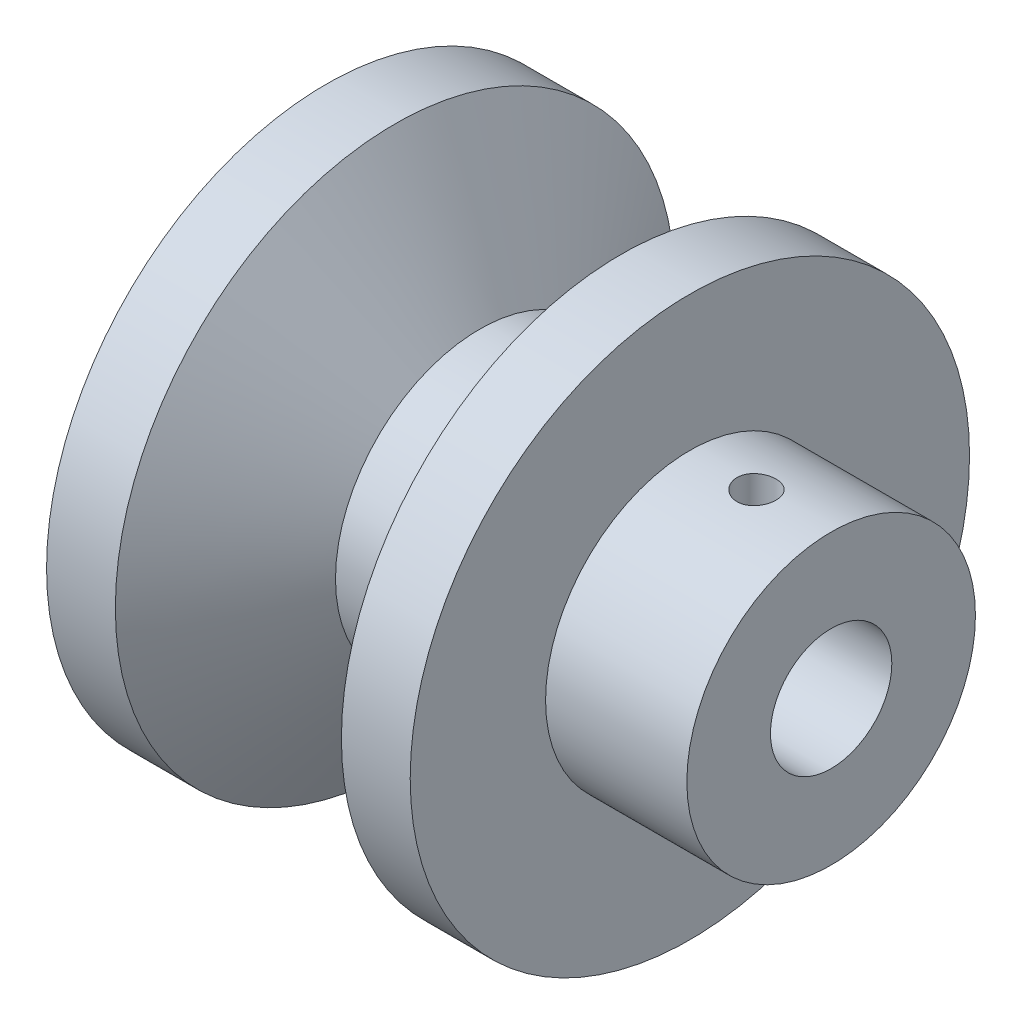
ISO-10303-21;
HEADER;
FILE_DESCRIPTION(('STEP AP214'),'2;1');
FILE_NAME('part.step','',(''),(''),'','','');
FILE_SCHEMA(('AUTOMOTIVE_DESIGN { 1 0 10303 214 1 1 1 1 }'));
ENDSEC;
DATA;
#1=APPLICATION_CONTEXT('core data for automotive mechanical design processes');
#2=APPLICATION_PROTOCOL_DEFINITION('international standard','automotive_design',2000,#1);
#3=PRODUCT_CONTEXT('',#1,'mechanical');
#4=PRODUCT('Part','Part','',(#3));
#5=PRODUCT_RELATED_PRODUCT_CATEGORY('part','',(#4));
#6=PRODUCT_DEFINITION_FORMATION('','',#4);
#7=PRODUCT_DEFINITION_CONTEXT('part definition',#1,'design');
#8=PRODUCT_DEFINITION('design','',#6,#7);
#9=PRODUCT_DEFINITION_SHAPE('','',#8);
#10=(LENGTH_UNIT() NAMED_UNIT(*) SI_UNIT(.MILLI.,.METRE.));
#11=(NAMED_UNIT(*) PLANE_ANGLE_UNIT() SI_UNIT($,.RADIAN.));
#12=(NAMED_UNIT(*) SI_UNIT($,.STERADIAN.) SOLID_ANGLE_UNIT());
#13=UNCERTAINTY_MEASURE_WITH_UNIT(LENGTH_MEASURE(1.E-05),#10,'distance_accuracy_value','');
#14=(GEOMETRIC_REPRESENTATION_CONTEXT(3) GLOBAL_UNCERTAINTY_ASSIGNED_CONTEXT((#13)) GLOBAL_UNIT_ASSIGNED_CONTEXT((#10,
#11,#12)) REPRESENTATION_CONTEXT('',''));
#15=CARTESIAN_POINT('',(0.,0.,0.));
#16=DIRECTION('',(0.,0.,1.));
#17=DIRECTION('',(1.,0.,0.));
#18=AXIS2_PLACEMENT_3D('',#15,#16,#17);
#19=CARTESIAN_POINT('',(30.4564854289592,2.,0.));
#20=DIRECTION('',(0.,1.,0.));
#21=DIRECTION('',(0.,0.,1.));
#22=AXIS2_PLACEMENT_3D('',#19,#20,#21);
#23=CYLINDRICAL_SURFACE('',#22,1.38499999999999);
#24=CARTESIAN_POINT('',(30.4564854289592,10.1195197210804,1.38499999999999));
#25=CARTESIAN_POINT('',(30.3790740439014,10.119520913612,1.38499674412126));
#26=CARTESIAN_POINT('',(30.3016156588465,10.1204175827245,1.37848798437401));
#27=CARTESIAN_POINT('',(30.1488585713256,10.1239055894623,1.3526284334532));
#28=CARTESIAN_POINT('',(30.0735621465307,10.1264986504853,1.33326458224626));
#29=CARTESIAN_POINT('',(29.9273625411416,10.13308046059,1.28227968027197));
#30=CARTESIAN_POINT('',(29.8564562641508,10.1370682124796,1.25066738530119));
#31=CARTESIAN_POINT('',(29.7209667831908,10.1459888918828,1.17610249364959));
#32=CARTESIAN_POINT('',(29.6563825854714,10.1509216704886,1.13315168317538));
#33=CARTESIAN_POINT('',(29.5349347212818,10.1612128380215,1.03682740673539));
#34=CARTESIAN_POINT('',(29.4781185664187,10.1665735538696,0.983394278669537));
#35=CARTESIAN_POINT('',(29.3742305416989,10.1770957203958,0.867750773530306));
#36=CARTESIAN_POINT('',(29.3271591766663,10.1822571607393,0.805539942012812));
#37=CARTESIAN_POINT('',(29.243924362765,10.1918232769019,0.673805817267354));
#38=CARTESIAN_POINT('',(29.2078042412051,10.1962249178516,0.604254908992159));
#39=CARTESIAN_POINT('',(29.1477749534494,10.2037498287602,0.460004401856181));
#40=CARTESIAN_POINT('',(29.1238652571513,10.2068731542147,0.385305026670298));
#41=CARTESIAN_POINT('',(29.0890783869195,10.2114731186708,0.23336554474921));
#42=CARTESIAN_POINT('',(29.0781219532465,10.2129597684362,0.156143892646332));
#43=CARTESIAN_POINT('',(29.0693067944137,10.2141531138358,0.000944733410465818));
#44=CARTESIAN_POINT('',(29.0714474682394,10.2138598911469,-0.0770327388746688));
#45=CARTESIAN_POINT('',(29.088702630623,10.2115345883273,-0.230990184958046));
#46=CARTESIAN_POINT('',(29.103731866355,10.2095139347542,-0.306979910626907));
#47=CARTESIAN_POINT('',(29.1462040379589,10.2039735846852,-0.455348651017259));
#48=CARTESIAN_POINT('',(29.1736472443887,10.2004538555176,-0.527727587004783));
#49=CARTESIAN_POINT('',(29.2402576383731,10.192291136544,-0.667081733304434));
#50=CARTESIAN_POINT('',(29.2794613146187,10.1876446595532,-0.734039289689667));
#51=CARTESIAN_POINT('',(29.368453219803,10.1777474970631,-0.860457449554726));
#52=CARTESIAN_POINT('',(29.4182420194468,10.1724967789928,-0.919917648533247));
#53=CARTESIAN_POINT('',(29.5274673219541,10.1619281044271,-1.030154787475));
#54=CARTESIAN_POINT('',(29.5869781808526,10.1566099467632,-1.08085806288397));
#55=CARTESIAN_POINT('',(29.7137040135259,10.1465472530637,-1.17156846542298));
#56=CARTESIAN_POINT('',(29.780919019808,10.1418027194486,-1.21157554741852));
#57=CARTESIAN_POINT('',(29.9212152670812,10.1334245973719,-1.27976441324816));
#58=CARTESIAN_POINT('',(29.9942997409046,10.1297916265176,-1.30793962627679));
#59=CARTESIAN_POINT('',(30.1442231886679,10.1240595417335,-1.35159612388183));
#60=CARTESIAN_POINT('',(30.2210619480945,10.1219603402757,-1.36707813282949));
#61=CARTESIAN_POINT('',(30.375660266871,10.1195497404784,-1.38480979658756));
#62=CARTESIAN_POINT('',(30.4534076901606,10.1192242951303,-1.3871634232455));
#63=CARTESIAN_POINT('',(30.6081877746604,10.1203608495394,-1.37884646940414));
#64=CARTESIAN_POINT('',(30.685220453829,10.1218228042641,-1.36817621703497));
#65=CARTESIAN_POINT('',(30.8360685737644,10.1263565825262,-1.33420219776878));
#66=CARTESIAN_POINT('',(30.9098956967631,10.1294219146273,-1.31094935974363));
#67=CARTESIAN_POINT('',(31.0526036689417,10.1368117669702,-1.25252287755388));
#68=CARTESIAN_POINT('',(31.1214843154264,10.1411363387761,-1.21734874521919));
#69=CARTESIAN_POINT('',(31.2528127315736,10.1505908309421,-1.13582485589675));
#70=CARTESIAN_POINT('',(31.3152180423448,10.155725570724,-1.08940726931248));
#71=CARTESIAN_POINT('',(31.4313898029897,10.1662069689217,-0.98680933750565));
#72=CARTESIAN_POINT('',(31.485155855756,10.1715536370647,-0.930628543759871));
#73=CARTESIAN_POINT('',(31.5828913972412,10.1818999178985,-0.809643273488275));
#74=CARTESIAN_POINT('',(31.6267923289876,10.1868969451363,-0.744783161455045));
#75=CARTESIAN_POINT('',(31.7030757622354,10.1959416643393,-0.608548935136784));
#76=CARTESIAN_POINT('',(31.7354585303045,10.1999893782739,-0.537174971651446));
#77=CARTESIAN_POINT('',(31.7876746667801,10.2066679912822,-0.39016133414912));
#78=CARTESIAN_POINT('',(31.8075467924318,10.2093032622135,-0.314535632780203));
#79=CARTESIAN_POINT('',(31.8343033853378,10.2128783030427,-0.160982671563141));
#80=CARTESIAN_POINT('',(31.8411885472575,10.2138181636271,-0.0830555350439591));
#81=CARTESIAN_POINT('',(31.8417611894974,10.2138958671133,0.0722206595914395));
#82=CARTESIAN_POINT('',(31.8355540479878,10.2130480984159,0.149569342843199));
#83=CARTESIAN_POINT('',(31.8103425486142,10.2096745563807,0.302112964583427));
#84=CARTESIAN_POINT('',(31.791338211399,10.2071487857504,0.377307906546837));
#85=CARTESIAN_POINT('',(31.7411066459115,10.2007017029831,0.523389582885759));
#86=CARTESIAN_POINT('',(31.7098853822346,10.1967810719349,0.594278400133009));
#87=CARTESIAN_POINT('',(31.6361172139279,10.1879769836146,0.729827547561494));
#88=CARTESIAN_POINT('',(31.5935700793267,10.1830935067924,0.79448775123465));
#89=CARTESIAN_POINT('',(31.4979714373557,10.1728610917798,0.916281151209041));
#90=CARTESIAN_POINT('',(31.4448417231475,10.1675088651894,0.97335268926977));
#91=CARTESIAN_POINT('',(31.3297498851701,10.1569677421821,1.0778099521844));
#92=CARTESIAN_POINT('',(31.2677856817499,10.1517788845746,1.12519339003508));
#93=CARTESIAN_POINT('',(31.136456518809,10.1421267943599,1.20911805551096));
#94=CARTESIAN_POINT('',(31.0670591764287,10.1376669698908,1.24560898293068));
#95=CARTESIAN_POINT('',(30.9230969519903,10.1300177932645,1.30636513796554));
#96=CARTESIAN_POINT('',(30.8485376844288,10.126827085438,1.33064341849972));
#97=CARTESIAN_POINT('',(30.7207577518744,10.1228371504512,1.36059346381276));
#98=CARTESIAN_POINT('',(30.6683367632037,10.121599468843,1.36973241988329));
#99=CARTESIAN_POINT('',(30.562779709117,10.1199403486097,1.38193677681131));
#100=CARTESIAN_POINT('',(30.5096436505508,10.1195189021716,1.3850022358045));
#101=CARTESIAN_POINT('',(30.4564854289592,10.1195197210804,1.38499999999999));
#102=B_SPLINE_CURVE_WITH_KNOTS('',3,(#24,#25,#26,#27,#28,#29,#30,#31,#32,#33,#34,#35,#36,#37,
#38,#39,#40,#41,#42,#43,#44,#45,#46,#47,#48,#49,#50,#51,#52,#53,#54,#55,#56,#57,#58,#59,#60,#61,
#62,#63,#64,#65,#66,#67,#68,#69,#70,#71,#72,#73,#74,#75,#76,#77,#78,#79,#80,#81,#82,#83,#84,#85,
#86,#87,#88,#89,#90,#91,#92,#93,#94,#95,#96,#97,#98,#99,#100,#101),.UNSPECIFIED.,.T.,.F.,(4,2,2,
2,2,2,2,2,2,2,2,2,2,2,2,2,2,2,2,2,2,2,2,2,2,2,2,2,2,2,2,2,2,2,2,2,2,2,4),(0.,0.232039919432124,
0.464315939572,0.696426222700113,0.928499962264285,1.16193506366298,1.39538225503046,
1.62974134968179,1.8640902690236,2.09699768400945,2.32989441116537,2.56126239573642,
2.79263542312798,3.0247338796323,3.25684485307936,3.49082218053682,3.72480049528749,
3.95890857815054,4.19300330008667,4.42524141900007,4.65747368691096,4.8887729341866,
5.12008165417702,5.35282217978534,5.58557340035649,5.81989525921111,6.05421169474516,
6.28779861254594,6.52137303555795,6.75307462681678,6.98477584421697,7.21636408040508,
7.44795701934245,7.68132959800834,7.91475720389052,8.14924664020273,8.38348491803826,
8.54282772681401,8.7021690103479),.UNSPECIFIED.);
#103=CARTESIAN_POINT('',(30.4564854289592,10.1195197210804,1.38499999999999));
#104=VERTEX_POINT('',#103);
#105=EDGE_CURVE('E73',#104,#104,#102,.T.);
#106=ORIENTED_EDGE('',*,*,#105,.F.);
#107=EDGE_LOOP('',(#106));
#108=FACE_BOUND('',#107,.T.);
#109=CARTESIAN_POINT('',(30.4564854289508,3.42797066504808,0.));
#110=DIRECTION('',(0.,1.,0.));
#111=DIRECTION('',(0.,0.,1.));
#112=AXIS2_PLACEMENT_3D('',#109,#110,#111);
#113=CIRCLE('',#112,1.3850000000045);
#114=CARTESIAN_POINT('',(30.4564854289508,3.42797066504808,1.3850000000045));
#115=VERTEX_POINT('',#114);
#116=EDGE_CURVE('E37',#115,#115,#113,.T.);
#117=ORIENTED_EDGE('',*,*,#116,.F.);
#118=EDGE_LOOP('',(#117));
#119=FACE_BOUND('',#118,.T.);
#120=ADVANCED_FACE('F33',(#108,#119),#23,.F.);
#121=CARTESIAN_POINT('',(25.74,0.,0.));
#122=DIRECTION('',(1.,0.,0.));
#123=DIRECTION('',(0.,0.,-1.));
#124=AXIS2_PLACEMENT_3D('',#121,#122,#123);
#125=CYLINDRICAL_SURFACE('',#124,4.295);
#126=CARTESIAN_POINT('',(35.74,0.,0.));
#127=DIRECTION('',(1.,0.,0.));
#128=DIRECTION('',(0.,0.,-1.));
#129=AXIS2_PLACEMENT_3D('',#126,#127,#128);
#130=CIRCLE('',#129,4.295);
#131=CARTESIAN_POINT('',(35.74,0.,-4.295));
#132=VERTEX_POINT('',#131);
#133=EDGE_CURVE('E74',#132,#132,#130,.T.);
#134=ORIENTED_EDGE('',*,*,#133,.T.);
#135=EDGE_LOOP('',(#134));
#136=FACE_BOUND('',#135,.T.);
#137=DIRECTION('',(1.,0.,0.));
#138=VECTOR('',#137,1.);
#139=CARTESIAN_POINT('',(25.74,3.42797066504808,2.58767117686344));
#140=LINE('',#139,#138);
#141=CARTESIAN_POINT('',(32.74,3.42797066504808,2.58767117686344));
#142=VERTEX_POINT('',#141);
#143=CARTESIAN_POINT('',(25.74,3.42797066504808,2.58767117686344));
#144=VERTEX_POINT('',#143);
#145=EDGE_CURVE('E49',#142,#144,#140,.F.);
#146=ORIENTED_EDGE('',*,*,#145,.F.);
#147=CARTESIAN_POINT('',(32.74,0.,0.));
#148=DIRECTION('',(1.,0.,0.));
#149=DIRECTION('',(0.,0.,-1.));
#150=AXIS2_PLACEMENT_3D('',#147,#148,#149);
#151=CIRCLE('',#150,4.295);
#152=CARTESIAN_POINT('',(32.74,3.42797066504808,-2.58767117686344));
#153=VERTEX_POINT('',#152);
#154=EDGE_CURVE('E11',#142,#153,#151,.F.);
#155=ORIENTED_EDGE('',*,*,#154,.T.);
#156=DIRECTION('',(-1.,0.,0.));
#157=VECTOR('',#156,1.);
#158=CARTESIAN_POINT('',(32.74,3.42797066504808,-2.58767117686344));
#159=LINE('',#158,#157);
#160=CARTESIAN_POINT('',(25.74,3.42797066504808,-2.58767117686344));
#161=VERTEX_POINT('',#160);
#162=EDGE_CURVE('E61',#153,#161,#159,.T.);
#163=ORIENTED_EDGE('',*,*,#162,.T.);
#164=CARTESIAN_POINT('',(25.74,0.,0.));
#165=DIRECTION('',(1.,0.,0.));
#166=DIRECTION('',(0.,0.,-1.));
#167=AXIS2_PLACEMENT_3D('',#164,#165,#166);
#168=CIRCLE('',#167,4.295);
#169=EDGE_CURVE('E69',#144,#161,#168,.T.);
#170=ORIENTED_EDGE('',*,*,#169,.F.);
#171=EDGE_LOOP('',(#146,#155,#163,#170));
#172=FACE_BOUND('',#171,.T.);
#173=ADVANCED_FACE('F68',(#136,#172),#125,.F.);
#174=CARTESIAN_POINT('',(25.74,0.,0.));
#175=DIRECTION('',(1.,0.,0.));
#176=DIRECTION('',(0.,0.,-1.));
#177=AXIS2_PLACEMENT_3D('',#174,#175,#176);
#178=PLANE('',#177);
#179=ORIENTED_EDGE('',*,*,#169,.T.);
#180=DIRECTION('',(0.,0.,1.));
#181=VECTOR('',#180,1.);
#182=CARTESIAN_POINT('',(25.74,3.42797066504808,0.));
#183=LINE('',#182,#181);
#184=EDGE_CURVE('E42',#161,#144,#183,.T.);
#185=ORIENTED_EDGE('',*,*,#184,.T.);
#186=EDGE_LOOP('',(#179,#185));
#187=FACE_BOUND('',#186,.T.);
#188=ADVANCED_FACE('F72',(#187),#178,.T.);
#189=CARTESIAN_POINT('',(0.,0.,0.));
#190=DIRECTION('',(1.,0.,0.));
#191=DIRECTION('',(0.,0.,-1.));
#192=AXIS2_PLACEMENT_3D('',#189,#190,#191);
#193=PLANE('',#192);
#194=CARTESIAN_POINT('',(0.,0.,0.));
#195=DIRECTION('',(-1.,0.,0.));
#196=DIRECTION('',(0.,0.,1.));
#197=AXIS2_PLACEMENT_3D('',#194,#195,#196);
#198=CIRCLE('',#197,19.795);
#199=CARTESIAN_POINT('',(0.,0.,19.795));
#200=VERTEX_POINT('',#199);
#201=EDGE_CURVE('E65',#200,#200,#198,.T.);
#202=ORIENTED_EDGE('',*,*,#201,.T.);
#203=EDGE_LOOP('',(#202));
#204=FACE_BOUND('',#203,.T.);
#205=ADVANCED_FACE('F35',(#204),#193,.F.);
#206=CARTESIAN_POINT('',(-743.156397809563,0.,0.));
#207=DIRECTION('',(-1.,0.,0.));
#208=DIRECTION('',(0.,0.,1.));
#209=AXIS2_PLACEMENT_3D('',#206,#207,#208);
#210=CYLINDRICAL_SURFACE('',#209,19.795);
#211=ORIENTED_EDGE('',*,*,#201,.F.);
#212=EDGE_LOOP('',(#211));
#213=FACE_BOUND('',#212,.T.);
#214=CARTESIAN_POINT('',(4.87000000000004,0.,0.));
#215=DIRECTION('',(-1.,0.,0.));
#216=DIRECTION('',(0.,0.,1.));
#217=AXIS2_PLACEMENT_3D('',#214,#215,#216);
#218=CIRCLE('',#217,19.795);
#219=CARTESIAN_POINT('',(4.87000000000004,0.,19.795));
#220=VERTEX_POINT('',#219);
#221=EDGE_CURVE('E100',#220,#220,#218,.T.);
#222=ORIENTED_EDGE('',*,*,#221,.T.);
#223=EDGE_LOOP('',(#222));
#224=FACE_BOUND('',#223,.T.);
#225=ADVANCED_FACE('F141',(#213,#224),#210,.T.);
#226=CARTESIAN_POINT('',(10.87,0.,0.));
#227=DIRECTION('',(-1.,0.,0.));
#228=DIRECTION('',(0.,0.,1.));
#229=AXIS2_PLACEMENT_3D('',#226,#227,#228);
#230=CONICAL_SURFACE('',#229,10.2138584474886,1.01131287661841);
#231=ORIENTED_EDGE('',*,*,#221,.F.);
#232=EDGE_LOOP('',(#231));
#233=FACE_BOUND('',#232,.T.);
#234=CARTESIAN_POINT('',(10.87,0.,0.));
#235=DIRECTION('',(-1.,0.,0.));
#236=DIRECTION('',(0.,0.,1.));
#237=AXIS2_PLACEMENT_3D('',#234,#235,#236);
#238=CIRCLE('',#237,10.2138584474886);
#239=CARTESIAN_POINT('',(10.87,0.,10.2138584474886));
#240=VERTEX_POINT('',#239);
#241=EDGE_CURVE('E97',#240,#240,#238,.T.);
#242=ORIENTED_EDGE('',*,*,#241,.T.);
#243=EDGE_LOOP('',(#242));
#244=FACE_BOUND('',#243,.T.);
#245=ADVANCED_FACE('F200',(#233,#244),#230,.T.);
#246=CARTESIAN_POINT('',(-743.156397809563,0.,0.));
#247=DIRECTION('',(-1.,0.,0.));
#248=DIRECTION('',(0.,0.,1.));
#249=AXIS2_PLACEMENT_3D('',#246,#247,#248);
#250=CYLINDRICAL_SURFACE('',#249,10.2138584474886);
#251=ORIENTED_EDGE('',*,*,#241,.F.);
#252=EDGE_LOOP('',(#251));
#253=FACE_BOUND('',#252,.T.);
#254=CARTESIAN_POINT('',(14.8700000000001,0.,0.));
#255=DIRECTION('',(-1.,0.,0.));
#256=DIRECTION('',(0.,0.,1.));
#257=AXIS2_PLACEMENT_3D('',#254,#255,#256);
#258=CIRCLE('',#257,10.2138584474886);
#259=CARTESIAN_POINT('',(14.8700000000001,0.,10.2138584474886));
#260=VERTEX_POINT('',#259);
#261=EDGE_CURVE('E94',#260,#260,#258,.T.);
#262=ORIENTED_EDGE('',*,*,#261,.T.);
#263=EDGE_LOOP('',(#262));
#264=FACE_BOUND('',#263,.T.);
#265=ADVANCED_FACE('F192',(#253,#264),#250,.T.);
#266=CARTESIAN_POINT('',(20.8700000000001,0.,0.));
#267=DIRECTION('',(1.,0.,0.));
#268=DIRECTION('',(0.,0.,-1.));
#269=AXIS2_PLACEMENT_3D('',#266,#267,#268);
#270=CONICAL_SURFACE('',#269,19.795,1.01131287661841);
#271=ORIENTED_EDGE('',*,*,#261,.F.);
#272=EDGE_LOOP('',(#271));
#273=FACE_BOUND('',#272,.T.);
#274=CARTESIAN_POINT('',(20.8700000000001,0.,0.));
#275=DIRECTION('',(-1.,0.,0.));
#276=DIRECTION('',(0.,0.,1.));
#277=AXIS2_PLACEMENT_3D('',#274,#275,#276);
#278=CIRCLE('',#277,19.795);
#279=CARTESIAN_POINT('',(20.8700000000001,0.,19.795));
#280=VERTEX_POINT('',#279);
#281=EDGE_CURVE('E91',#280,#280,#278,.T.);
#282=ORIENTED_EDGE('',*,*,#281,.T.);
#283=EDGE_LOOP('',(#282));
#284=FACE_BOUND('',#283,.T.);
#285=ADVANCED_FACE('F184',(#273,#284),#270,.T.);
#286=CARTESIAN_POINT('',(-743.156397809563,0.,0.));
#287=DIRECTION('',(-1.,0.,0.));
#288=DIRECTION('',(0.,0.,1.));
#289=AXIS2_PLACEMENT_3D('',#286,#287,#288);
#290=CYLINDRICAL_SURFACE('',#289,19.795);
#291=ORIENTED_EDGE('',*,*,#281,.F.);
#292=EDGE_LOOP('',(#291));
#293=FACE_BOUND('',#292,.T.);
#294=CARTESIAN_POINT('',(25.74,0.,0.));
#295=DIRECTION('',(-1.,0.,0.));
#296=DIRECTION('',(0.,0.,1.));
#297=AXIS2_PLACEMENT_3D('',#294,#295,#296);
#298=CIRCLE('',#297,19.795);
#299=CARTESIAN_POINT('',(25.74,0.,19.795));
#300=VERTEX_POINT('',#299);
#301=EDGE_CURVE('E88',#300,#300,#298,.T.);
#302=ORIENTED_EDGE('',*,*,#301,.T.);
#303=EDGE_LOOP('',(#302));
#304=FACE_BOUND('',#303,.T.);
#305=ADVANCED_FACE('F178',(#293,#304),#290,.T.);
#306=CARTESIAN_POINT('',(25.74,19.795,0.));
#307=DIRECTION('',(-1.,0.,0.));
#308=DIRECTION('',(0.,0.,1.));
#309=AXIS2_PLACEMENT_3D('',#306,#307,#308);
#310=PLANE('',#309);
#311=ORIENTED_EDGE('',*,*,#301,.F.);
#312=EDGE_LOOP('',(#311));
#313=FACE_BOUND('',#312,.T.);
#314=CARTESIAN_POINT('',(25.74,0.,0.));
#315=DIRECTION('',(-1.,0.,0.));
#316=DIRECTION('',(0.,0.,1.));
#317=AXIS2_PLACEMENT_3D('',#314,#315,#316);
#318=CIRCLE('',#317,10.2138584474886);
#319=CARTESIAN_POINT('',(25.74,0.,10.2138584474886));
#320=VERTEX_POINT('',#319);
#321=EDGE_CURVE('E85',#320,#320,#318,.T.);
#322=ORIENTED_EDGE('',*,*,#321,.T.);
#323=EDGE_LOOP('',(#322));
#324=FACE_BOUND('',#323,.T.);
#325=ADVANCED_FACE('F128',(#313,#324),#310,.F.);
#326=CARTESIAN_POINT('',(-743.156397809563,0.,0.));
#327=DIRECTION('',(-1.,0.,0.));
#328=DIRECTION('',(0.,0.,1.));
#329=AXIS2_PLACEMENT_3D('',#326,#327,#328);
#330=CYLINDRICAL_SURFACE('',#329,10.2138584474886);
#331=ORIENTED_EDGE('',*,*,#105,.T.);
#332=EDGE_LOOP('',(#331));
#333=FACE_BOUND('',#332,.T.);
#334=ORIENTED_EDGE('',*,*,#321,.F.);
#335=EDGE_LOOP('',(#334));
#336=FACE_BOUND('',#335,.T.);
#337=CARTESIAN_POINT('',(35.74,0.,0.));
#338=DIRECTION('',(-1.,0.,0.));
#339=DIRECTION('',(0.,0.,1.));
#340=AXIS2_PLACEMENT_3D('',#337,#338,#339);
#341=CIRCLE('',#340,10.2138584474886);
#342=CARTESIAN_POINT('',(35.74,0.,10.2138584474886));
#343=VERTEX_POINT('',#342);
#344=EDGE_CURVE('E77',#343,#343,#341,.T.);
#345=ORIENTED_EDGE('',*,*,#344,.T.);
#346=EDGE_LOOP('',(#345));
#347=FACE_BOUND('',#346,.T.);
#348=ADVANCED_FACE('F108',(#333,#336,#347),#330,.T.);
#349=CARTESIAN_POINT('',(35.74,10.2138584474886,0.));
#350=DIRECTION('',(-1.,0.,0.));
#351=DIRECTION('',(0.,0.,1.));
#352=AXIS2_PLACEMENT_3D('',#349,#350,#351);
#353=PLANE('',#352);
#354=ORIENTED_EDGE('',*,*,#133,.F.);
#355=EDGE_LOOP('',(#354));
#356=FACE_BOUND('',#355,.T.);
#357=ORIENTED_EDGE('',*,*,#344,.F.);
#358=EDGE_LOOP('',(#357));
#359=FACE_BOUND('',#358,.T.);
#360=ADVANCED_FACE('F117',(#356,#359),#353,.F.);
#361=CARTESIAN_POINT('',(32.74,3.42797066504808,2.75687226342693));
#362=DIRECTION('',(0.,1.,0.));
#363=DIRECTION('',(0.,0.,1.));
#364=AXIS2_PLACEMENT_3D('',#361,#362,#363);
#365=PLANE('',#364);
#366=ORIENTED_EDGE('',*,*,#116,.T.);
#367=EDGE_LOOP('',(#366));
#368=FACE_BOUND('',#367,.T.);
#369=DIRECTION('',(0.,0.,-1.));
#370=VECTOR('',#369,1.);
#371=CARTESIAN_POINT('',(32.74,3.42797066504808,2.75687226342693));
#372=LINE('',#371,#370);
#373=EDGE_CURVE('E70',#142,#153,#372,.T.);
#374=ORIENTED_EDGE('',*,*,#373,.F.);
#375=ORIENTED_EDGE('',*,*,#145,.T.);
#376=ORIENTED_EDGE('',*,*,#184,.F.);
#377=ORIENTED_EDGE('',*,*,#162,.F.);
#378=EDGE_LOOP('',(#374,#375,#376,#377));
#379=FACE_BOUND('',#378,.T.);
#380=ADVANCED_FACE('F60',(#368,#379),#365,.F.);
#381=CARTESIAN_POINT('',(32.74,0.,0.));
#382=DIRECTION('',(1.,0.,0.));
#383=DIRECTION('',(0.,0.,-1.));
#384=AXIS2_PLACEMENT_3D('',#381,#382,#383);
#385=PLANE('',#384);
#386=ORIENTED_EDGE('',*,*,#154,.F.);
#387=ORIENTED_EDGE('',*,*,#373,.T.);
#388=EDGE_LOOP('',(#386,#387));
#389=FACE_BOUND('',#388,.T.);
#390=ADVANCED_FACE('F125',(#389),#385,.T.);
#391=CLOSED_SHELL('',(#120,#173,#188,#205,#225,#245,#265,#285,#305,#325,#348,#360,#380,#390));
#392=MANIFOLD_SOLID_BREP('B2',#391);
#393=ADVANCED_BREP_SHAPE_REPRESENTATION('',(#18,#392),#14);
#394=SHAPE_DEFINITION_REPRESENTATION(#9,#393);
ENDSEC;
END-ISO-10303-21;
